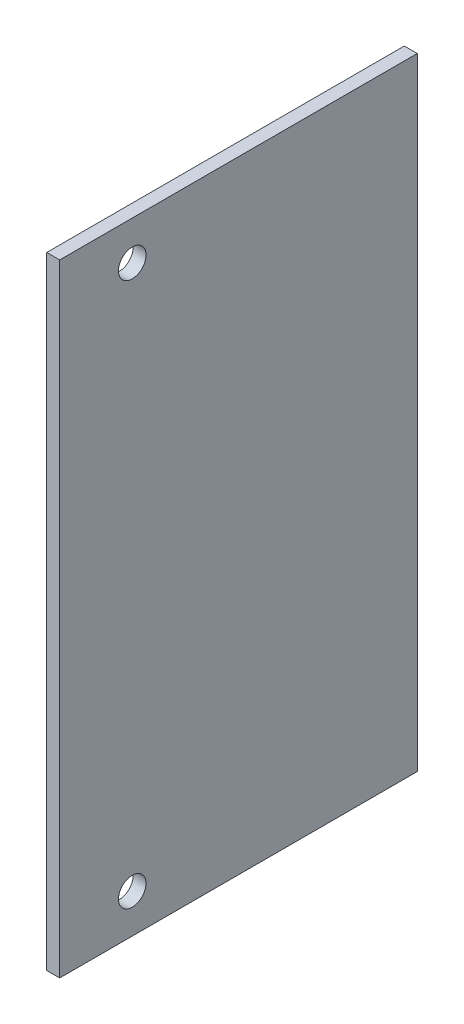
ISO-10303-21;
HEADER;
FILE_DESCRIPTION(('STEP AP214'),'2;1');
FILE_NAME('part.step','',(''),(''),'','','');
FILE_SCHEMA(('AUTOMOTIVE_DESIGN { 1 0 10303 214 1 1 1 1 }'));
ENDSEC;
DATA;
#1=APPLICATION_CONTEXT('core data for automotive mechanical design processes');
#2=APPLICATION_PROTOCOL_DEFINITION('international standard','automotive_design',2000,#1);
#3=PRODUCT_CONTEXT('',#1,'mechanical');
#4=PRODUCT('Part','Part','',(#3));
#5=PRODUCT_RELATED_PRODUCT_CATEGORY('part','',(#4));
#6=PRODUCT_DEFINITION_FORMATION('','',#4);
#7=PRODUCT_DEFINITION_CONTEXT('part definition',#1,'design');
#8=PRODUCT_DEFINITION('design','',#6,#7);
#9=PRODUCT_DEFINITION_SHAPE('','',#8);
#10=(LENGTH_UNIT() NAMED_UNIT(*) SI_UNIT(.MILLI.,.METRE.));
#11=(NAMED_UNIT(*) PLANE_ANGLE_UNIT() SI_UNIT($,.RADIAN.));
#12=(NAMED_UNIT(*) SI_UNIT($,.STERADIAN.) SOLID_ANGLE_UNIT());
#13=UNCERTAINTY_MEASURE_WITH_UNIT(LENGTH_MEASURE(1.E-05),#10,'distance_accuracy_value','');
#14=(GEOMETRIC_REPRESENTATION_CONTEXT(3) GLOBAL_UNCERTAINTY_ASSIGNED_CONTEXT((#13)) GLOBAL_UNIT_ASSIGNED_CONTEXT((#10,
#11,#12)) REPRESENTATION_CONTEXT('',''));
#15=CARTESIAN_POINT('',(0.,0.,0.));
#16=DIRECTION('',(0.,0.,1.));
#17=DIRECTION('',(1.,0.,0.));
#18=AXIS2_PLACEMENT_3D('',#15,#16,#17);
#19=CARTESIAN_POINT('',(3.175,0.,0.));
#20=DIRECTION('',(0.,0.,-1.));
#21=DIRECTION('',(-1.,0.,0.));
#22=AXIS2_PLACEMENT_3D('',#19,#20,#21);
#23=PLANE('',#22);
#24=DIRECTION('',(0.,-1.,0.));
#25=VECTOR('',#24,1.);
#26=CARTESIAN_POINT('',(0.,0.,0.));
#27=LINE('',#26,#25);
#28=CARTESIAN_POINT('',(0.,152.4,0.));
#29=VERTEX_POINT('',#28);
#30=CARTESIAN_POINT('',(0.,0.,0.));
#31=VERTEX_POINT('',#30);
#32=EDGE_CURVE('E102',#29,#31,#27,.T.);
#33=ORIENTED_EDGE('',*,*,#32,.T.);
#34=DIRECTION('',(-1.,0.,0.));
#35=VECTOR('',#34,1.);
#36=CARTESIAN_POINT('',(3.175,0.,0.));
#37=LINE('',#36,#35);
#38=CARTESIAN_POINT('',(3.175,0.,0.));
#39=VERTEX_POINT('',#38);
#40=EDGE_CURVE('E11',#39,#31,#37,.T.);
#41=ORIENTED_EDGE('',*,*,#40,.F.);
#42=DIRECTION('',(0.,-1.,0.));
#43=VECTOR('',#42,1.);
#44=CARTESIAN_POINT('',(3.175,0.,0.));
#45=LINE('',#44,#43);
#46=CARTESIAN_POINT('',(3.175,152.4,0.));
#47=VERTEX_POINT('',#46);
#48=EDGE_CURVE('E90',#47,#39,#45,.T.);
#49=ORIENTED_EDGE('',*,*,#48,.F.);
#50=DIRECTION('',(-1.,0.,0.));
#51=VECTOR('',#50,1.);
#52=CARTESIAN_POINT('',(3.175,152.4,0.));
#53=LINE('',#52,#51);
#54=EDGE_CURVE('E98',#47,#29,#53,.T.);
#55=ORIENTED_EDGE('',*,*,#54,.T.);
#56=EDGE_LOOP('',(#33,#41,#49,#55));
#57=FACE_BOUND('',#56,.T.);
#58=ADVANCED_FACE('F39',(#57),#23,.F.);
#59=CARTESIAN_POINT('',(3.175,0.,0.));
#60=DIRECTION('',(0.,1.,0.));
#61=DIRECTION('',(0.,0.,1.));
#62=AXIS2_PLACEMENT_3D('',#59,#60,#61);
#63=PLANE('',#62);
#64=DIRECTION('',(0.,0.,-1.));
#65=VECTOR('',#64,1.);
#66=CARTESIAN_POINT('',(0.,0.,0.));
#67=LINE('',#66,#65);
#68=CARTESIAN_POINT('',(0.,0.,-87.63));
#69=VERTEX_POINT('',#68);
#70=EDGE_CURVE('E94',#31,#69,#67,.T.);
#71=ORIENTED_EDGE('',*,*,#70,.T.);
#72=DIRECTION('',(-1.,0.,0.));
#73=VECTOR('',#72,1.);
#74=CARTESIAN_POINT('',(3.175,0.,-87.63));
#75=LINE('',#74,#73);
#76=CARTESIAN_POINT('',(3.175,0.,-87.63));
#77=VERTEX_POINT('',#76);
#78=EDGE_CURVE('E47',#77,#69,#75,.T.);
#79=ORIENTED_EDGE('',*,*,#78,.F.);
#80=DIRECTION('',(0.,0.,-1.));
#81=VECTOR('',#80,1.);
#82=CARTESIAN_POINT('',(3.175,0.,0.));
#83=LINE('',#82,#81);
#84=EDGE_CURVE('E85',#39,#77,#83,.T.);
#85=ORIENTED_EDGE('',*,*,#84,.F.);
#86=ORIENTED_EDGE('',*,*,#40,.T.);
#87=EDGE_LOOP('',(#71,#79,#85,#86));
#88=FACE_BOUND('',#87,.T.);
#89=ADVANCED_FACE('F93',(#88),#63,.F.);
#90=CARTESIAN_POINT('',(3.175,0.,-87.63));
#91=DIRECTION('',(0.,0.,1.));
#92=DIRECTION('',(1.,0.,0.));
#93=AXIS2_PLACEMENT_3D('',#90,#91,#92);
#94=PLANE('',#93);
#95=DIRECTION('',(0.,1.,0.));
#96=VECTOR('',#95,1.);
#97=CARTESIAN_POINT('',(0.,0.,-87.63));
#98=LINE('',#97,#96);
#99=CARTESIAN_POINT('',(0.,152.4,-87.63));
#100=VERTEX_POINT('',#99);
#101=EDGE_CURVE('E72',#69,#100,#98,.T.);
#102=ORIENTED_EDGE('',*,*,#101,.T.);
#103=DIRECTION('',(-1.,0.,0.));
#104=VECTOR('',#103,1.);
#105=CARTESIAN_POINT('',(3.175,152.4,-87.63));
#106=LINE('',#105,#104);
#107=CARTESIAN_POINT('',(3.175,152.4,-87.63));
#108=VERTEX_POINT('',#107);
#109=EDGE_CURVE('E95',#108,#100,#106,.T.);
#110=ORIENTED_EDGE('',*,*,#109,.F.);
#111=DIRECTION('',(0.,1.,0.));
#112=VECTOR('',#111,1.);
#113=CARTESIAN_POINT('',(3.175,0.,-87.63));
#114=LINE('',#113,#112);
#115=EDGE_CURVE('E88',#77,#108,#114,.T.);
#116=ORIENTED_EDGE('',*,*,#115,.F.);
#117=ORIENTED_EDGE('',*,*,#78,.T.);
#118=EDGE_LOOP('',(#102,#110,#116,#117));
#119=FACE_BOUND('',#118,.T.);
#120=ADVANCED_FACE('F96',(#119),#94,.F.);
#121=CARTESIAN_POINT('',(3.175,152.4,0.));
#122=DIRECTION('',(0.,-1.,0.));
#123=DIRECTION('',(0.,0.,-1.));
#124=AXIS2_PLACEMENT_3D('',#121,#122,#123);
#125=PLANE('',#124);
#126=DIRECTION('',(0.,0.,1.));
#127=VECTOR('',#126,1.);
#128=CARTESIAN_POINT('',(0.,152.4,0.));
#129=LINE('',#128,#127);
#130=EDGE_CURVE('E78',#100,#29,#129,.T.);
#131=ORIENTED_EDGE('',*,*,#130,.T.);
#132=ORIENTED_EDGE('',*,*,#54,.F.);
#133=DIRECTION('',(0.,0.,1.));
#134=VECTOR('',#133,1.);
#135=CARTESIAN_POINT('',(3.175,152.4,0.));
#136=LINE('',#135,#134);
#137=EDGE_CURVE('E55',#108,#47,#136,.T.);
#138=ORIENTED_EDGE('',*,*,#137,.F.);
#139=ORIENTED_EDGE('',*,*,#109,.T.);
#140=EDGE_LOOP('',(#131,#132,#138,#139));
#141=FACE_BOUND('',#140,.T.);
#142=ADVANCED_FACE('F110',(#141),#125,.F.);
#143=CARTESIAN_POINT('',(3.175,0.,0.));
#144=DIRECTION('',(-1.,0.,0.));
#145=DIRECTION('',(0.,0.,1.));
#146=AXIS2_PLACEMENT_3D('',#143,#144,#145);
#147=PLANE('',#146);
#148=CARTESIAN_POINT('',(3.175,142.875,-17.78));
#149=DIRECTION('',(1.,0.,0.));
#150=DIRECTION('',(0.,0.,-1.));
#151=AXIS2_PLACEMENT_3D('',#148,#149,#150);
#152=CIRCLE('',#151,3.3782);
#153=CARTESIAN_POINT('',(3.175,142.875,-21.1582));
#154=VERTEX_POINT('',#153);
#155=EDGE_CURVE('E124',#154,#154,#152,.T.);
#156=ORIENTED_EDGE('',*,*,#155,.F.);
#157=EDGE_LOOP('',(#156));
#158=FACE_BOUND('',#157,.T.);
#159=CARTESIAN_POINT('',(3.175,9.52500000000001,-17.78));
#160=DIRECTION('',(1.,0.,0.));
#161=DIRECTION('',(0.,0.,-1.));
#162=AXIS2_PLACEMENT_3D('',#159,#160,#161);
#163=CIRCLE('',#162,3.37819999999999);
#164=CARTESIAN_POINT('',(3.175,9.52500000000001,-21.1582));
#165=VERTEX_POINT('',#164);
#166=EDGE_CURVE('E118',#165,#165,#163,.T.);
#167=ORIENTED_EDGE('',*,*,#166,.F.);
#168=EDGE_LOOP('',(#167));
#169=FACE_BOUND('',#168,.T.);
#170=ORIENTED_EDGE('',*,*,#48,.T.);
#171=ORIENTED_EDGE('',*,*,#84,.T.);
#172=ORIENTED_EDGE('',*,*,#115,.T.);
#173=ORIENTED_EDGE('',*,*,#137,.T.);
#174=EDGE_LOOP('',(#170,#171,#172,#173));
#175=FACE_BOUND('',#174,.T.);
#176=ADVANCED_FACE('F86',(#158,#169,#175),#147,.F.);
#177=CARTESIAN_POINT('',(0.,0.,0.));
#178=DIRECTION('',(-1.,0.,0.));
#179=DIRECTION('',(0.,0.,1.));
#180=AXIS2_PLACEMENT_3D('',#177,#178,#179);
#181=PLANE('',#180);
#182=CARTESIAN_POINT('',(0.,142.875,-17.78));
#183=DIRECTION('',(-1.,0.,0.));
#184=DIRECTION('',(0.,0.,1.));
#185=AXIS2_PLACEMENT_3D('',#182,#183,#184);
#186=CIRCLE('',#185,3.3782);
#187=CARTESIAN_POINT('',(0.,142.875,-14.4018));
#188=VERTEX_POINT('',#187);
#189=EDGE_CURVE('E121',#188,#188,#186,.T.);
#190=ORIENTED_EDGE('',*,*,#189,.F.);
#191=EDGE_LOOP('',(#190));
#192=FACE_BOUND('',#191,.T.);
#193=CARTESIAN_POINT('',(0.,9.52500000000001,-17.78));
#194=DIRECTION('',(-1.,0.,0.));
#195=DIRECTION('',(0.,0.,1.));
#196=AXIS2_PLACEMENT_3D('',#193,#194,#195);
#197=CIRCLE('',#196,3.37819999999999);
#198=CARTESIAN_POINT('',(0.,9.52500000000001,-14.4018));
#199=VERTEX_POINT('',#198);
#200=EDGE_CURVE('E105',#199,#199,#197,.T.);
#201=ORIENTED_EDGE('',*,*,#200,.F.);
#202=EDGE_LOOP('',(#201));
#203=FACE_BOUND('',#202,.T.);
#204=ORIENTED_EDGE('',*,*,#32,.F.);
#205=ORIENTED_EDGE('',*,*,#130,.F.);
#206=ORIENTED_EDGE('',*,*,#101,.F.);
#207=ORIENTED_EDGE('',*,*,#70,.F.);
#208=EDGE_LOOP('',(#204,#205,#206,#207));
#209=FACE_BOUND('',#208,.T.);
#210=ADVANCED_FACE('F113',(#192,#203,#209),#181,.T.);
#211=CARTESIAN_POINT('',(3.175,9.52500000000001,-17.78));
#212=DIRECTION('',(1.,0.,0.));
#213=DIRECTION('',(0.,0.,-1.));
#214=AXIS2_PLACEMENT_3D('',#211,#212,#213);
#215=CYLINDRICAL_SURFACE('',#214,3.37819999999999);
#216=ORIENTED_EDGE('',*,*,#166,.T.);
#217=EDGE_LOOP('',(#216));
#218=FACE_BOUND('',#217,.T.);
#219=ORIENTED_EDGE('',*,*,#200,.T.);
#220=EDGE_LOOP('',(#219));
#221=FACE_BOUND('',#220,.T.);
#222=ADVANCED_FACE('F136',(#218,#221),#215,.F.);
#223=CARTESIAN_POINT('',(3.175,142.875,-17.78));
#224=DIRECTION('',(1.,0.,0.));
#225=DIRECTION('',(0.,0.,-1.));
#226=AXIS2_PLACEMENT_3D('',#223,#224,#225);
#227=CYLINDRICAL_SURFACE('',#226,3.3782);
#228=ORIENTED_EDGE('',*,*,#155,.T.);
#229=EDGE_LOOP('',(#228));
#230=FACE_BOUND('',#229,.T.);
#231=ORIENTED_EDGE('',*,*,#189,.T.);
#232=EDGE_LOOP('',(#231));
#233=FACE_BOUND('',#232,.T.);
#234=ADVANCED_FACE('F128',(#230,#233),#227,.F.);
#235=CLOSED_SHELL('',(#58,#89,#120,#142,#176,#210,#222,#234));
#236=MANIFOLD_SOLID_BREP('B2',#235);
#237=ADVANCED_BREP_SHAPE_REPRESENTATION('',(#18,#236),#14);
#238=SHAPE_DEFINITION_REPRESENTATION(#9,#237);
ENDSEC;
END-ISO-10303-21;
